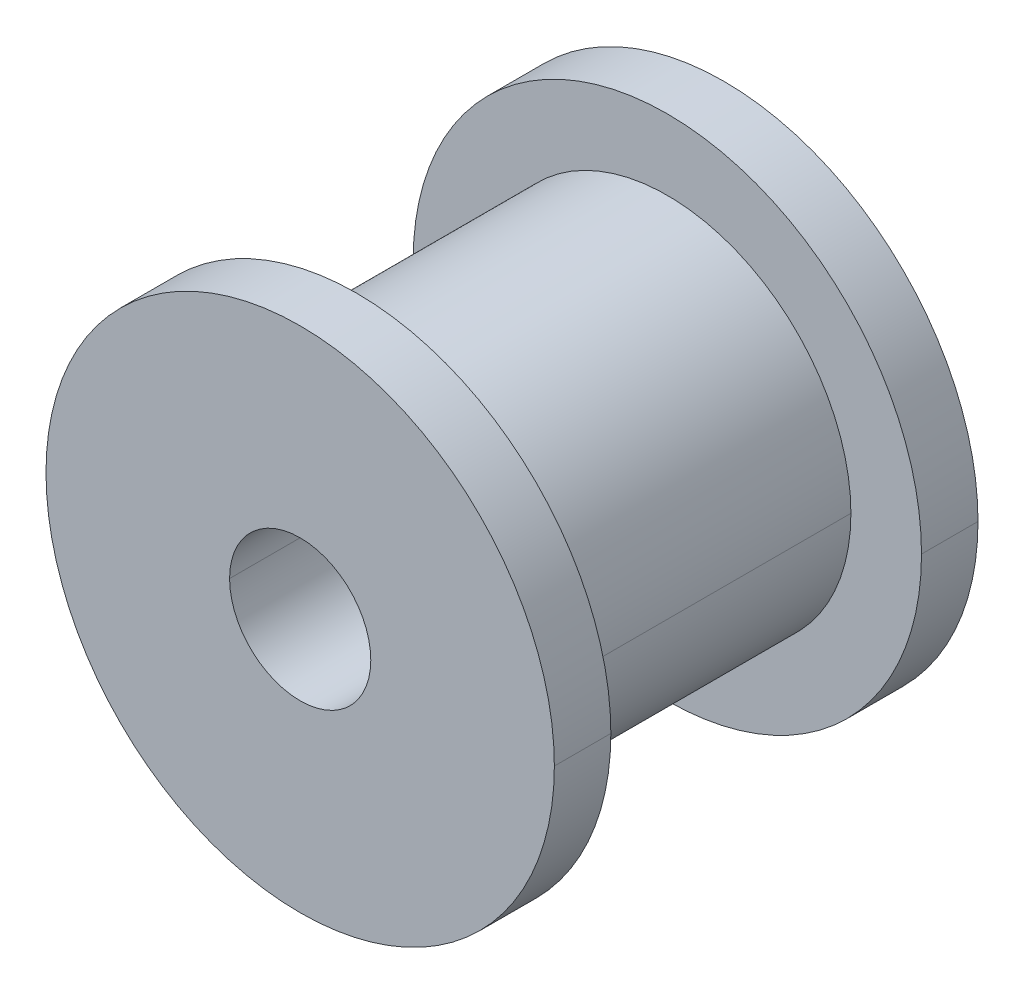
ISO-10303-21;
HEADER;
FILE_DESCRIPTION(('STEP AP214'),'2;1');
FILE_NAME('part.step','',(''),(''),'','','');
FILE_SCHEMA(('AUTOMOTIVE_DESIGN { 1 0 10303 214 1 1 1 1 }'));
ENDSEC;
DATA;
#1=APPLICATION_CONTEXT('core data for automotive mechanical design processes');
#2=APPLICATION_PROTOCOL_DEFINITION('international standard','automotive_design',2000,#1);
#3=PRODUCT_CONTEXT('',#1,'mechanical');
#4=PRODUCT('Part','Part','',(#3));
#5=PRODUCT_RELATED_PRODUCT_CATEGORY('part','',(#4));
#6=PRODUCT_DEFINITION_FORMATION('','',#4);
#7=PRODUCT_DEFINITION_CONTEXT('part definition',#1,'design');
#8=PRODUCT_DEFINITION('design','',#6,#7);
#9=PRODUCT_DEFINITION_SHAPE('','',#8);
#10=(LENGTH_UNIT() NAMED_UNIT(*) SI_UNIT(.MILLI.,.METRE.));
#11=(NAMED_UNIT(*) PLANE_ANGLE_UNIT() SI_UNIT($,.RADIAN.));
#12=(NAMED_UNIT(*) SI_UNIT($,.STERADIAN.) SOLID_ANGLE_UNIT());
#13=UNCERTAINTY_MEASURE_WITH_UNIT(LENGTH_MEASURE(1.E-05),#10,'distance_accuracy_value','');
#14=(GEOMETRIC_REPRESENTATION_CONTEXT(3) GLOBAL_UNCERTAINTY_ASSIGNED_CONTEXT((#13)) GLOBAL_UNIT_ASSIGNED_CONTEXT((#10,
#11,#12)) REPRESENTATION_CONTEXT('',''));
#15=CARTESIAN_POINT('',(0.,0.,0.));
#16=DIRECTION('',(0.,0.,1.));
#17=DIRECTION('',(1.,0.,0.));
#18=AXIS2_PLACEMENT_3D('',#15,#16,#17);
#19=CARTESIAN_POINT('',(0.,0.,15.));
#20=DIRECTION('',(0.,0.,-1.));
#21=DIRECTION('',(-1.,0.,0.));
#22=AXIS2_PLACEMENT_3D('',#19,#20,#21);
#23=CYLINDRICAL_SURFACE('',#22,9.);
#24=DIRECTION('',(0.,0.,-1.));
#25=VECTOR('',#24,1.);
#26=CARTESIAN_POINT('',(9.,0.,15.));
#27=LINE('',#26,#25);
#28=CARTESIAN_POINT('',(9.,0.,15.));
#29=VERTEX_POINT('',#28);
#30=CARTESIAN_POINT('',(9.,0.,13.));
#31=VERTEX_POINT('',#30);
#32=EDGE_CURVE('E128',#29,#31,#27,.T.);
#33=ORIENTED_EDGE('',*,*,#32,.F.);
#34=CARTESIAN_POINT('',(0.,0.,15.));
#35=DIRECTION('',(0.,0.,1.));
#36=DIRECTION('',(1.,0.,0.));
#37=AXIS2_PLACEMENT_3D('',#34,#35,#36);
#38=CIRCLE('',#37,9.);
#39=CARTESIAN_POINT('',(-9.,0.,15.));
#40=VERTEX_POINT('',#39);
#41=EDGE_CURVE('E26',#40,#29,#38,.T.);
#42=ORIENTED_EDGE('',*,*,#41,.F.);
#43=DIRECTION('',(0.,0.,-1.));
#44=VECTOR('',#43,1.);
#45=CARTESIAN_POINT('',(-9.,0.,15.));
#46=LINE('',#45,#44);
#47=CARTESIAN_POINT('',(-9.,0.,13.));
#48=VERTEX_POINT('',#47);
#49=EDGE_CURVE('E177',#40,#48,#46,.T.);
#50=ORIENTED_EDGE('',*,*,#49,.T.);
#51=CARTESIAN_POINT('',(0.,0.,13.));
#52=DIRECTION('',(0.,0.,1.));
#53=DIRECTION('',(1.,0.,0.));
#54=AXIS2_PLACEMENT_3D('',#51,#52,#53);
#55=CIRCLE('',#54,9.);
#56=EDGE_CURVE('E10',#48,#31,#55,.T.);
#57=ORIENTED_EDGE('',*,*,#56,.T.);
#58=EDGE_LOOP('',(#33,#42,#50,#57));
#59=FACE_BOUND('',#58,.T.);
#60=ADVANCED_FACE('F16',(#59),#23,.T.);
#61=CARTESIAN_POINT('',(0.,0.,13.));
#62=DIRECTION('',(0.,0.,1.));
#63=DIRECTION('',(1.,0.,0.));
#64=AXIS2_PLACEMENT_3D('',#61,#62,#63);
#65=PLANE('',#64);
#66=CARTESIAN_POINT('',(0.,0.,13.));
#67=DIRECTION('',(0.,0.,1.));
#68=DIRECTION('',(1.,0.,0.));
#69=AXIS2_PLACEMENT_3D('',#66,#67,#68);
#70=CIRCLE('',#69,6.5);
#71=CARTESIAN_POINT('',(-6.5,0.,13.));
#72=VERTEX_POINT('',#71);
#73=CARTESIAN_POINT('',(6.5,0.,13.));
#74=VERTEX_POINT('',#73);
#75=EDGE_CURVE('E133',#72,#74,#70,.T.);
#76=ORIENTED_EDGE('',*,*,#75,.T.);
#77=CARTESIAN_POINT('',(0.,0.,13.));
#78=DIRECTION('',(0.,0.,1.));
#79=DIRECTION('',(1.,0.,0.));
#80=AXIS2_PLACEMENT_3D('',#77,#78,#79);
#81=CIRCLE('',#80,6.5);
#82=EDGE_CURVE('E127',#74,#72,#81,.T.);
#83=ORIENTED_EDGE('',*,*,#82,.T.);
#84=EDGE_LOOP('',(#76,#83));
#85=FACE_BOUND('',#84,.T.);
#86=ORIENTED_EDGE('',*,*,#56,.F.);
#87=CARTESIAN_POINT('',(0.,0.,13.));
#88=DIRECTION('',(0.,0.,1.));
#89=DIRECTION('',(1.,0.,0.));
#90=AXIS2_PLACEMENT_3D('',#87,#88,#89);
#91=CIRCLE('',#90,9.);
#92=EDGE_CURVE('E131',#31,#48,#91,.T.);
#93=ORIENTED_EDGE('',*,*,#92,.F.);
#94=EDGE_LOOP('',(#86,#93));
#95=FACE_BOUND('',#94,.T.);
#96=ADVANCED_FACE('F218',(#85,#95),#65,.F.);
#97=CARTESIAN_POINT('',(0.,0.,15.));
#98=DIRECTION('',(0.,0.,1.));
#99=DIRECTION('',(1.,0.,0.));
#100=AXIS2_PLACEMENT_3D('',#97,#98,#99);
#101=PLANE('',#100);
#102=CARTESIAN_POINT('',(0.,0.,15.));
#103=DIRECTION('',(0.,0.,1.));
#104=DIRECTION('',(1.,0.,0.));
#105=AXIS2_PLACEMENT_3D('',#102,#103,#104);
#106=CIRCLE('',#105,2.5);
#107=CARTESIAN_POINT('',(-2.5,0.,15.));
#108=VERTEX_POINT('',#107);
#109=CARTESIAN_POINT('',(2.5,0.,15.));
#110=VERTEX_POINT('',#109);
#111=EDGE_CURVE('E159',#108,#110,#106,.T.);
#112=ORIENTED_EDGE('',*,*,#111,.F.);
#113=CARTESIAN_POINT('',(0.,0.,15.));
#114=DIRECTION('',(0.,0.,1.));
#115=DIRECTION('',(1.,0.,0.));
#116=AXIS2_PLACEMENT_3D('',#113,#114,#115);
#117=CIRCLE('',#116,2.5);
#118=EDGE_CURVE('E135',#110,#108,#117,.T.);
#119=ORIENTED_EDGE('',*,*,#118,.F.);
#120=EDGE_LOOP('',(#112,#119));
#121=FACE_BOUND('',#120,.T.);
#122=ORIENTED_EDGE('',*,*,#41,.T.);
#123=CARTESIAN_POINT('',(0.,0.,15.));
#124=DIRECTION('',(0.,0.,1.));
#125=DIRECTION('',(1.,0.,0.));
#126=AXIS2_PLACEMENT_3D('',#123,#124,#125);
#127=CIRCLE('',#126,9.);
#128=EDGE_CURVE('E132',#29,#40,#127,.T.);
#129=ORIENTED_EDGE('',*,*,#128,.T.);
#130=EDGE_LOOP('',(#122,#129));
#131=FACE_BOUND('',#130,.T.);
#132=ADVANCED_FACE('F220',(#121,#131),#101,.T.);
#133=CARTESIAN_POINT('',(0.,0.,13.));
#134=DIRECTION('',(0.,0.,-1.));
#135=DIRECTION('',(-1.,0.,0.));
#136=AXIS2_PLACEMENT_3D('',#133,#134,#135);
#137=CYLINDRICAL_SURFACE('',#136,6.5);
#138=DIRECTION('',(0.,0.,-1.));
#139=VECTOR('',#138,1.);
#140=CARTESIAN_POINT('',(6.5,0.,13.));
#141=LINE('',#140,#139);
#142=CARTESIAN_POINT('',(6.5,0.,2.));
#143=VERTEX_POINT('',#142);
#144=EDGE_CURVE('E122',#74,#143,#141,.T.);
#145=ORIENTED_EDGE('',*,*,#144,.F.);
#146=ORIENTED_EDGE('',*,*,#75,.F.);
#147=DIRECTION('',(0.,0.,-1.));
#148=VECTOR('',#147,1.);
#149=CARTESIAN_POINT('',(-6.5,0.,13.));
#150=LINE('',#149,#148);
#151=CARTESIAN_POINT('',(-6.5,0.,2.));
#152=VERTEX_POINT('',#151);
#153=EDGE_CURVE('E164',#72,#152,#150,.T.);
#154=ORIENTED_EDGE('',*,*,#153,.T.);
#155=CARTESIAN_POINT('',(0.,0.,2.));
#156=DIRECTION('',(0.,0.,1.));
#157=DIRECTION('',(1.,0.,0.));
#158=AXIS2_PLACEMENT_3D('',#155,#156,#157);
#159=CIRCLE('',#158,6.5);
#160=EDGE_CURVE('E101',#152,#143,#159,.T.);
#161=ORIENTED_EDGE('',*,*,#160,.T.);
#162=EDGE_LOOP('',(#145,#146,#154,#161));
#163=FACE_BOUND('',#162,.T.);
#164=ADVANCED_FACE('F213',(#163),#137,.T.);
#165=CARTESIAN_POINT('',(0.,0.,2.));
#166=DIRECTION('',(0.,0.,-1.));
#167=DIRECTION('',(-1.,0.,0.));
#168=AXIS2_PLACEMENT_3D('',#165,#166,#167);
#169=CYLINDRICAL_SURFACE('',#168,2.5);
#170=DIRECTION('',(0.,0.,-1.));
#171=VECTOR('',#170,1.);
#172=CARTESIAN_POINT('',(2.5,0.,2.));
#173=LINE('',#172,#171);
#174=CARTESIAN_POINT('',(2.5,0.,0.));
#175=VERTEX_POINT('',#174);
#176=EDGE_CURVE('E163',#110,#175,#173,.T.);
#177=ORIENTED_EDGE('',*,*,#176,.F.);
#178=ORIENTED_EDGE('',*,*,#118,.T.);
#179=DIRECTION('',(0.,0.,-1.));
#180=VECTOR('',#179,1.);
#181=CARTESIAN_POINT('',(-2.5,0.,2.));
#182=LINE('',#181,#180);
#183=CARTESIAN_POINT('',(-2.5,0.,0.));
#184=VERTEX_POINT('',#183);
#185=EDGE_CURVE('E111',#108,#184,#182,.T.);
#186=ORIENTED_EDGE('',*,*,#185,.T.);
#187=CARTESIAN_POINT('',(0.,0.,0.));
#188=DIRECTION('',(0.,0.,1.));
#189=DIRECTION('',(1.,0.,0.));
#190=AXIS2_PLACEMENT_3D('',#187,#188,#189);
#191=CIRCLE('',#190,2.5);
#192=EDGE_CURVE('E144',#175,#184,#191,.T.);
#193=ORIENTED_EDGE('',*,*,#192,.F.);
#194=EDGE_LOOP('',(#177,#178,#186,#193));
#195=FACE_BOUND('',#194,.T.);
#196=ADVANCED_FACE('F194',(#195),#169,.F.);
#197=CARTESIAN_POINT('',(0.,0.,2.));
#198=DIRECTION('',(0.,0.,-1.));
#199=DIRECTION('',(-1.,0.,0.));
#200=AXIS2_PLACEMENT_3D('',#197,#198,#199);
#201=CYLINDRICAL_SURFACE('',#200,9.);
#202=DIRECTION('',(0.,0.,-1.));
#203=VECTOR('',#202,1.);
#204=CARTESIAN_POINT('',(9.,0.,2.));
#205=LINE('',#204,#203);
#206=CARTESIAN_POINT('',(9.,0.,2.));
#207=VERTEX_POINT('',#206);
#208=CARTESIAN_POINT('',(9.,0.,0.));
#209=VERTEX_POINT('',#208);
#210=EDGE_CURVE('E96',#207,#209,#205,.T.);
#211=ORIENTED_EDGE('',*,*,#210,.F.);
#212=CARTESIAN_POINT('',(0.,0.,2.));
#213=DIRECTION('',(0.,0.,1.));
#214=DIRECTION('',(1.,0.,0.));
#215=AXIS2_PLACEMENT_3D('',#212,#213,#214);
#216=CIRCLE('',#215,9.);
#217=CARTESIAN_POINT('',(-9.,0.,2.));
#218=VERTEX_POINT('',#217);
#219=EDGE_CURVE('E90',#218,#207,#216,.T.);
#220=ORIENTED_EDGE('',*,*,#219,.F.);
#221=DIRECTION('',(0.,0.,-1.));
#222=VECTOR('',#221,1.);
#223=CARTESIAN_POINT('',(-9.,0.,2.));
#224=LINE('',#223,#222);
#225=CARTESIAN_POINT('',(-9.,0.,0.));
#226=VERTEX_POINT('',#225);
#227=EDGE_CURVE('E93',#218,#226,#224,.T.);
#228=ORIENTED_EDGE('',*,*,#227,.T.);
#229=CARTESIAN_POINT('',(0.,0.,0.));
#230=DIRECTION('',(0.,0.,1.));
#231=DIRECTION('',(1.,0.,0.));
#232=AXIS2_PLACEMENT_3D('',#229,#230,#231);
#233=CIRCLE('',#232,9.);
#234=EDGE_CURVE('E39',#226,#209,#233,.T.);
#235=ORIENTED_EDGE('',*,*,#234,.T.);
#236=EDGE_LOOP('',(#211,#220,#228,#235));
#237=FACE_BOUND('',#236,.T.);
#238=ADVANCED_FACE('F92',(#237),#201,.T.);
#239=CARTESIAN_POINT('',(0.,0.,0.));
#240=DIRECTION('',(0.,0.,1.));
#241=DIRECTION('',(1.,0.,0.));
#242=AXIS2_PLACEMENT_3D('',#239,#240,#241);
#243=PLANE('',#242);
#244=CARTESIAN_POINT('',(0.,0.,0.));
#245=DIRECTION('',(0.,0.,1.));
#246=DIRECTION('',(1.,0.,0.));
#247=AXIS2_PLACEMENT_3D('',#244,#245,#246);
#248=CIRCLE('',#247,2.5);
#249=EDGE_CURVE('E119',#184,#175,#248,.T.);
#250=ORIENTED_EDGE('',*,*,#249,.T.);
#251=ORIENTED_EDGE('',*,*,#192,.T.);
#252=EDGE_LOOP('',(#250,#251));
#253=FACE_BOUND('',#252,.T.);
#254=ORIENTED_EDGE('',*,*,#234,.F.);
#255=CARTESIAN_POINT('',(0.,0.,0.));
#256=DIRECTION('',(0.,0.,1.));
#257=DIRECTION('',(1.,0.,0.));
#258=AXIS2_PLACEMENT_3D('',#255,#256,#257);
#259=CIRCLE('',#258,9.);
#260=EDGE_CURVE('E106',#209,#226,#259,.T.);
#261=ORIENTED_EDGE('',*,*,#260,.F.);
#262=EDGE_LOOP('',(#254,#261));
#263=FACE_BOUND('',#262,.T.);
#264=ADVANCED_FACE('F18',(#253,#263),#243,.F.);
#265=CARTESIAN_POINT('',(0.,0.,2.));
#266=DIRECTION('',(0.,0.,1.));
#267=DIRECTION('',(1.,0.,0.));
#268=AXIS2_PLACEMENT_3D('',#265,#266,#267);
#269=PLANE('',#268);
#270=ORIENTED_EDGE('',*,*,#160,.F.);
#271=CARTESIAN_POINT('',(0.,0.,2.));
#272=DIRECTION('',(0.,0.,1.));
#273=DIRECTION('',(1.,0.,0.));
#274=AXIS2_PLACEMENT_3D('',#271,#272,#273);
#275=CIRCLE('',#274,6.5);
#276=EDGE_CURVE('E126',#143,#152,#275,.T.);
#277=ORIENTED_EDGE('',*,*,#276,.F.);
#278=EDGE_LOOP('',(#270,#277));
#279=FACE_BOUND('',#278,.T.);
#280=ORIENTED_EDGE('',*,*,#219,.T.);
#281=CARTESIAN_POINT('',(0.,0.,2.));
#282=DIRECTION('',(0.,0.,1.));
#283=DIRECTION('',(1.,0.,0.));
#284=AXIS2_PLACEMENT_3D('',#281,#282,#283);
#285=CIRCLE('',#284,9.);
#286=EDGE_CURVE('E105',#207,#218,#285,.T.);
#287=ORIENTED_EDGE('',*,*,#286,.T.);
#288=EDGE_LOOP('',(#280,#287));
#289=FACE_BOUND('',#288,.T.);
#290=ADVANCED_FACE('F109',(#279,#289),#269,.T.);
#291=CARTESIAN_POINT('',(0.,0.,2.));
#292=DIRECTION('',(0.,0.,-1.));
#293=DIRECTION('',(-1.,0.,0.));
#294=AXIS2_PLACEMENT_3D('',#291,#292,#293);
#295=CYLINDRICAL_SURFACE('',#294,9.);
#296=ORIENTED_EDGE('',*,*,#286,.F.);
#297=ORIENTED_EDGE('',*,*,#210,.T.);
#298=ORIENTED_EDGE('',*,*,#260,.T.);
#299=ORIENTED_EDGE('',*,*,#227,.F.);
#300=EDGE_LOOP('',(#296,#297,#298,#299));
#301=FACE_BOUND('',#300,.T.);
#302=ADVANCED_FACE('F104',(#301),#295,.T.);
#303=CARTESIAN_POINT('',(0.,0.,2.));
#304=DIRECTION('',(0.,0.,-1.));
#305=DIRECTION('',(-1.,0.,0.));
#306=AXIS2_PLACEMENT_3D('',#303,#304,#305);
#307=CYLINDRICAL_SURFACE('',#306,2.5);
#308=ORIENTED_EDGE('',*,*,#111,.T.);
#309=ORIENTED_EDGE('',*,*,#176,.T.);
#310=ORIENTED_EDGE('',*,*,#249,.F.);
#311=ORIENTED_EDGE('',*,*,#185,.F.);
#312=EDGE_LOOP('',(#308,#309,#310,#311));
#313=FACE_BOUND('',#312,.T.);
#314=ADVANCED_FACE('F188',(#313),#307,.F.);
#315=CARTESIAN_POINT('',(0.,0.,13.));
#316=DIRECTION('',(0.,0.,-1.));
#317=DIRECTION('',(-1.,0.,0.));
#318=AXIS2_PLACEMENT_3D('',#315,#316,#317);
#319=CYLINDRICAL_SURFACE('',#318,6.5);
#320=ORIENTED_EDGE('',*,*,#82,.F.);
#321=ORIENTED_EDGE('',*,*,#144,.T.);
#322=ORIENTED_EDGE('',*,*,#276,.T.);
#323=ORIENTED_EDGE('',*,*,#153,.F.);
#324=EDGE_LOOP('',(#320,#321,#322,#323));
#325=FACE_BOUND('',#324,.T.);
#326=ADVANCED_FACE('F217',(#325),#319,.T.);
#327=CARTESIAN_POINT('',(0.,0.,15.));
#328=DIRECTION('',(0.,0.,-1.));
#329=DIRECTION('',(-1.,0.,0.));
#330=AXIS2_PLACEMENT_3D('',#327,#328,#329);
#331=CYLINDRICAL_SURFACE('',#330,9.);
#332=ORIENTED_EDGE('',*,*,#128,.F.);
#333=ORIENTED_EDGE('',*,*,#32,.T.);
#334=ORIENTED_EDGE('',*,*,#92,.T.);
#335=ORIENTED_EDGE('',*,*,#49,.F.);
#336=EDGE_LOOP('',(#332,#333,#334,#335));
#337=FACE_BOUND('',#336,.T.);
#338=ADVANCED_FACE('F236',(#337),#331,.T.);
#339=CLOSED_SHELL('',(#60,#96,#132,#164,#196,#238,#264,#290,#302,#314,#326,#338));
#340=MANIFOLD_SOLID_BREP('B1',#339);
#341=ADVANCED_BREP_SHAPE_REPRESENTATION('',(#18,#340),#14);
#342=SHAPE_DEFINITION_REPRESENTATION(#9,#341);
ENDSEC;
END-ISO-10303-21;
